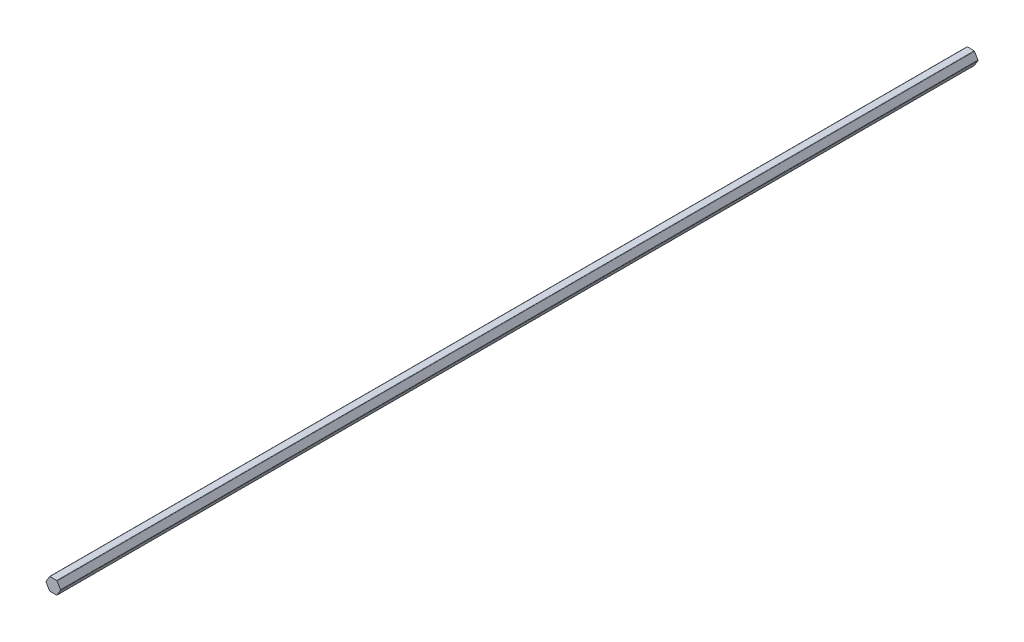
ISO-10303-21;
HEADER;
FILE_DESCRIPTION(('STEP AP214'),'2;1');
FILE_NAME('part.step','',(''),(''),'','','');
FILE_SCHEMA(('AUTOMOTIVE_DESIGN { 1 0 10303 214 1 1 1 1 }'));
ENDSEC;
DATA;
#1=APPLICATION_CONTEXT('core data for automotive mechanical design processes');
#2=APPLICATION_PROTOCOL_DEFINITION('international standard','automotive_design',2000,#1);
#3=PRODUCT_CONTEXT('',#1,'mechanical');
#4=PRODUCT('Part','Part','',(#3));
#5=PRODUCT_RELATED_PRODUCT_CATEGORY('part','',(#4));
#6=PRODUCT_DEFINITION_FORMATION('','',#4);
#7=PRODUCT_DEFINITION_CONTEXT('part definition',#1,'design');
#8=PRODUCT_DEFINITION('design','',#6,#7);
#9=PRODUCT_DEFINITION_SHAPE('','',#8);
#10=(LENGTH_UNIT() NAMED_UNIT(*) SI_UNIT(.MILLI.,.METRE.));
#11=(NAMED_UNIT(*) PLANE_ANGLE_UNIT() SI_UNIT($,.RADIAN.));
#12=(NAMED_UNIT(*) SI_UNIT($,.STERADIAN.) SOLID_ANGLE_UNIT());
#13=UNCERTAINTY_MEASURE_WITH_UNIT(LENGTH_MEASURE(1.E-05),#10,'distance_accuracy_value','');
#14=(GEOMETRIC_REPRESENTATION_CONTEXT(3) GLOBAL_UNCERTAINTY_ASSIGNED_CONTEXT((#13)) GLOBAL_UNIT_ASSIGNED_CONTEXT((#10,
#11,#12)) REPRESENTATION_CONTEXT('',''));
#15=CARTESIAN_POINT('',(0.,0.,0.));
#16=DIRECTION('',(0.,0.,1.));
#17=DIRECTION('',(1.,0.,0.));
#18=AXIS2_PLACEMENT_3D('',#15,#16,#17);
#19=CARTESIAN_POINT('',(-6.73109584837417,0.,457.2));
#20=DIRECTION('',(0.,0.,-1.));
#21=DIRECTION('',(-1.,0.,0.));
#22=AXIS2_PLACEMENT_3D('',#19,#20,#21);
#23=CYLINDRICAL_SURFACE('',#22,0.508);
#24=CARTESIAN_POINT('',(-6.73109584837417,0.,340.36));
#25=DIRECTION('',(0.,0.,-1.));
#26=DIRECTION('',(0.,1.,0.));
#27=AXIS2_PLACEMENT_3D('',#24,#25,#26);
#28=CIRCLE('',#27,0.508);
#29=CARTESIAN_POINT('',(-7.23909584837417,0.,340.36));
#30=VERTEX_POINT('',#29);
#31=CARTESIAN_POINT('',(-7.17103675349666,-0.254000000000007,340.36));
#32=VERTEX_POINT('',#31);
#33=EDGE_CURVE('P0_E257',#30,#32,#28,.F.);
#34=ORIENTED_EDGE('',*,*,#33,.F.);
#35=DIRECTION('',(0.,0.,-1.));
#36=VECTOR('',#35,1.);
#37=CARTESIAN_POINT('',(-7.23909584837417,0.,457.2));
#38=LINE('',#37,#36);
#39=CARTESIAN_POINT('',(-7.23909584837417,0.,301.9044));
#40=VERTEX_POINT('',#39);
#41=EDGE_CURVE('P0_E56',#30,#40,#38,.T.);
#42=ORIENTED_EDGE('',*,*,#41,.T.);
#43=CARTESIAN_POINT('',(-6.73109584837417,0.,301.9044));
#44=DIRECTION('',(0.,0.,1.));
#45=DIRECTION('',(1.,0.,0.));
#46=AXIS2_PLACEMENT_3D('',#43,#44,#45);
#47=CIRCLE('',#46,0.508);
#48=CARTESIAN_POINT('',(-7.17103675349667,-0.254000000000005,301.9044));
#49=VERTEX_POINT('',#48);
#50=EDGE_CURVE('P0_E226',#49,#40,#47,.F.);
#51=ORIENTED_EDGE('',*,*,#50,.F.);
#52=DIRECTION('',(0.,0.,-1.));
#53=VECTOR('',#52,1.);
#54=CARTESIAN_POINT('',(-7.17103675349666,-0.254000000000004,457.2));
#55=LINE('',#54,#53);
#56=EDGE_CURVE('P0_E181',#32,#49,#55,.T.);
#57=ORIENTED_EDGE('',*,*,#56,.F.);
#58=EDGE_LOOP('',(#34,#42,#51,#57));
#59=FACE_BOUND('',#58,.T.);
#60=ADVANCED_FACE('P0_F48',(#59),#23,.T.);
#61=CARTESIAN_POINT('',(3.65884186093541,-6.3373,457.2));
#62=DIRECTION('',(-0.866025403784439,0.5,0.));
#63=DIRECTION('',(0.,0.,1.));
#64=AXIS2_PLACEMENT_3D('',#61,#62,#63);
#65=PLANE('',#64);
#66=DIRECTION('',(0.,0.,1.));
#67=VECTOR('',#66,1.);
#68=CARTESIAN_POINT('',(7.17103675349667,-0.253999999999996,457.2));
#69=LINE('',#68,#67);
#70=CARTESIAN_POINT('',(7.17103675349666,-0.254000000000001,301.9044));
#71=VERTEX_POINT('',#70);
#72=CARTESIAN_POINT('',(7.17103675349667,-0.253999999999998,340.36));
#73=VERTEX_POINT('',#72);
#74=EDGE_CURVE('P0_E186',#71,#73,#69,.T.);
#75=ORIENTED_EDGE('',*,*,#74,.T.);
#76=DIRECTION('',(-0.5,-0.866025403784439,0.));
#77=VECTOR('',#76,1.);
#78=CARTESIAN_POINT('',(3.65884186093541,-6.3373,340.36));
#79=LINE('',#78,#77);
#80=CARTESIAN_POINT('',(3.80548882930958,-6.0833,340.36));
#81=VERTEX_POINT('',#80);
#82=EDGE_CURVE('P0_E200',#73,#81,#79,.T.);
#83=ORIENTED_EDGE('',*,*,#82,.T.);
#84=DIRECTION('',(0.,0.,-1.));
#85=VECTOR('',#84,1.);
#86=CARTESIAN_POINT('',(3.80548882930958,-6.0833,457.2));
#87=LINE('',#86,#85);
#88=CARTESIAN_POINT('',(3.80548882930958,-6.0833,301.9044));
#89=VERTEX_POINT('',#88);
#90=EDGE_CURVE('P0_E190',#81,#89,#87,.T.);
#91=ORIENTED_EDGE('',*,*,#90,.T.);
#92=DIRECTION('',(0.5,0.866025403784439,0.));
#93=VECTOR('',#92,1.);
#94=CARTESIAN_POINT('',(3.65884186093541,-6.3373,301.9044));
#95=LINE('',#94,#93);
#96=EDGE_CURVE('P0_E198',#89,#71,#95,.T.);
#97=ORIENTED_EDGE('',*,*,#96,.T.);
#98=EDGE_LOOP('',(#75,#83,#91,#97));
#99=FACE_BOUND('',#98,.T.);
#100=ADVANCED_FACE('P0_F197',(#99),#65,.F.);
#101=CARTESIAN_POINT('',(7.31768372187083,0.,457.2));
#102=DIRECTION('',(-0.866025403784439,-0.5,0.));
#103=DIRECTION('',(-0.5,0.866025403784439,0.));
#104=AXIS2_PLACEMENT_3D('',#101,#102,#103);
#105=PLANE('',#104);
#106=DIRECTION('',(0.,0.,1.));
#107=VECTOR('',#106,1.);
#108=CARTESIAN_POINT('',(3.80548882930958,6.0833,457.2));
#109=LINE('',#108,#107);
#110=CARTESIAN_POINT('',(3.80548882930958,6.0833,301.9044));
#111=VERTEX_POINT('',#110);
#112=CARTESIAN_POINT('',(3.80548882930958,6.0833,340.36));
#113=VERTEX_POINT('',#112);
#114=EDGE_CURVE('P0_E165',#111,#113,#109,.T.);
#115=ORIENTED_EDGE('',*,*,#114,.T.);
#116=DIRECTION('',(0.5,-0.866025403784439,0.));
#117=VECTOR('',#116,1.);
#118=CARTESIAN_POINT('',(7.31768372187083,0.,340.36));
#119=LINE('',#118,#117);
#120=CARTESIAN_POINT('',(7.17103675349667,0.254000000000004,340.36));
#121=VERTEX_POINT('',#120);
#122=EDGE_CURVE('P0_E62',#113,#121,#119,.T.);
#123=ORIENTED_EDGE('',*,*,#122,.T.);
#124=DIRECTION('',(0.,0.,-1.));
#125=VECTOR('',#124,1.);
#126=CARTESIAN_POINT('',(7.17103675349666,0.254,457.2));
#127=LINE('',#126,#125);
#128=CARTESIAN_POINT('',(7.17103675349666,0.254000000000006,301.9044));
#129=VERTEX_POINT('',#128);
#130=EDGE_CURVE('P0_E169',#121,#129,#127,.T.);
#131=ORIENTED_EDGE('',*,*,#130,.T.);
#132=DIRECTION('',(-0.5,0.866025403784439,0.));
#133=VECTOR('',#132,1.);
#134=CARTESIAN_POINT('',(7.31768372187083,0.,301.9044));
#135=LINE('',#134,#133);
#136=EDGE_CURVE('P0_E212',#129,#111,#135,.T.);
#137=ORIENTED_EDGE('',*,*,#136,.T.);
#138=EDGE_LOOP('',(#115,#123,#131,#137));
#139=FACE_BOUND('',#138,.T.);
#140=ADVANCED_FACE('P0_F246',(#139),#105,.F.);
#141=CARTESIAN_POINT('',(3.65884186093541,6.3373,457.2));
#142=DIRECTION('',(0.,-1.,0.));
#143=DIRECTION('',(0.,0.,-1.));
#144=AXIS2_PLACEMENT_3D('',#141,#142,#143);
#145=PLANE('',#144);
#146=DIRECTION('',(0.,0.,1.));
#147=VECTOR('',#146,1.);
#148=CARTESIAN_POINT('',(-3.36554792418709,6.3373,457.2));
#149=LINE('',#148,#147);
#150=CARTESIAN_POINT('',(-3.36554792418708,6.3373,301.9044));
#151=VERTEX_POINT('',#150);
#152=CARTESIAN_POINT('',(-3.36554792418708,6.3373,340.36));
#153=VERTEX_POINT('',#152);
#154=EDGE_CURVE('P0_E156',#151,#153,#149,.T.);
#155=ORIENTED_EDGE('',*,*,#154,.T.);
#156=DIRECTION('',(1.,0.,0.));
#157=VECTOR('',#156,1.);
#158=CARTESIAN_POINT('',(-23.9832777722907,6.3373,340.36));
#159=LINE('',#158,#157);
#160=CARTESIAN_POINT('',(3.36554792418708,6.3373,340.36));
#161=VERTEX_POINT('',#160);
#162=EDGE_CURVE('P0_E141',#153,#161,#159,.T.);
#163=ORIENTED_EDGE('',*,*,#162,.T.);
#164=DIRECTION('',(0.,0.,-1.));
#165=VECTOR('',#164,1.);
#166=CARTESIAN_POINT('',(3.36554792418709,6.3373,457.2));
#167=LINE('',#166,#165);
#168=CARTESIAN_POINT('',(3.36554792418708,6.3373,301.9044));
#169=VERTEX_POINT('',#168);
#170=EDGE_CURVE('P0_E166',#161,#169,#167,.T.);
#171=ORIENTED_EDGE('',*,*,#170,.T.);
#172=DIRECTION('',(-1.,0.,0.));
#173=VECTOR('',#172,1.);
#174=CARTESIAN_POINT('',(3.65884186093541,6.3373,301.9044));
#175=LINE('',#174,#173);
#176=EDGE_CURVE('P0_E164',#169,#151,#175,.T.);
#177=ORIENTED_EDGE('',*,*,#176,.T.);
#178=EDGE_LOOP('',(#155,#163,#171,#177));
#179=FACE_BOUND('',#178,.T.);
#180=ADVANCED_FACE('P0_F162',(#179),#145,.F.);
#181=CARTESIAN_POINT('',(-3.65884186093541,6.3373,457.2));
#182=DIRECTION('',(0.866025403784439,-0.5,0.));
#183=DIRECTION('',(0.,0.,-1.));
#184=AXIS2_PLACEMENT_3D('',#181,#182,#183);
#185=PLANE('',#184);
#186=DIRECTION('',(0.,0.,1.));
#187=VECTOR('',#186,1.);
#188=CARTESIAN_POINT('',(-7.17103675349666,0.253999999999995,457.2));
#189=LINE('',#188,#187);
#190=CARTESIAN_POINT('',(-7.17103675349667,0.253999999999994,301.9044));
#191=VERTEX_POINT('',#190);
#192=CARTESIAN_POINT('',(-7.17103675349667,0.253999999999996,340.36));
#193=VERTEX_POINT('',#192);
#194=EDGE_CURVE('P0_E171',#191,#193,#189,.T.);
#195=ORIENTED_EDGE('',*,*,#194,.T.);
#196=DIRECTION('',(0.5,0.866025403784439,0.));
#197=VECTOR('',#196,1.);
#198=CARTESIAN_POINT('',(-3.65884186093541,6.3373,340.36));
#199=LINE('',#198,#197);
#200=CARTESIAN_POINT('',(-3.80548882930958,6.0833,340.36));
#201=VERTEX_POINT('',#200);
#202=EDGE_CURVE('P0_E158',#193,#201,#199,.T.);
#203=ORIENTED_EDGE('',*,*,#202,.T.);
#204=DIRECTION('',(0.,0.,-1.));
#205=VECTOR('',#204,1.);
#206=CARTESIAN_POINT('',(-3.80548882930958,6.0833,457.2));
#207=LINE('',#206,#205);
#208=CARTESIAN_POINT('',(-3.80548882930958,6.0833,301.9044));
#209=VERTEX_POINT('',#208);
#210=EDGE_CURVE('P0_E157',#201,#209,#207,.T.);
#211=ORIENTED_EDGE('',*,*,#210,.T.);
#212=DIRECTION('',(0.5,0.866025403784439,0.));
#213=VECTOR('',#212,1.);
#214=CARTESIAN_POINT('',(-1.90274441465479,9.37895,301.9044));
#215=LINE('',#214,#213);
#216=EDGE_CURVE('P0_E234',#191,#209,#215,.T.);
#217=ORIENTED_EDGE('',*,*,#216,.F.);
#218=EDGE_LOOP('',(#195,#203,#211,#217));
#219=FACE_BOUND('',#218,.T.);
#220=ADVANCED_FACE('P0_F233',(#219),#185,.F.);
#221=CARTESIAN_POINT('',(-7.31768372187083,0.,457.2));
#222=DIRECTION('',(0.866025403784438,0.5,0.));
#223=DIRECTION('',(0.,0.,-1.));
#224=AXIS2_PLACEMENT_3D('',#221,#222,#223);
#225=PLANE('',#224);
#226=DIRECTION('',(0.,0.,1.));
#227=VECTOR('',#226,1.);
#228=CARTESIAN_POINT('',(-3.80548882930957,-6.0833,457.2));
#229=LINE('',#228,#227);
#230=CARTESIAN_POINT('',(-3.80548882930958,-6.0833,301.9044));
#231=VERTEX_POINT('',#230);
#232=CARTESIAN_POINT('',(-3.80548882930958,-6.0833,340.36));
#233=VERTEX_POINT('',#232);
#234=EDGE_CURVE('P0_E182',#231,#233,#229,.T.);
#235=ORIENTED_EDGE('',*,*,#234,.T.);
#236=DIRECTION('',(-0.5,0.866025403784438,0.));
#237=VECTOR('',#236,1.);
#238=CARTESIAN_POINT('',(-7.31768372187083,0.,340.36));
#239=LINE('',#238,#237);
#240=EDGE_CURVE('P0_E252',#233,#32,#239,.T.);
#241=ORIENTED_EDGE('',*,*,#240,.T.);
#242=ORIENTED_EDGE('',*,*,#56,.T.);
#243=DIRECTION('',(0.5,-0.866025403784438,0.));
#244=VECTOR('',#243,1.);
#245=CARTESIAN_POINT('',(-7.31768372187083,0.,301.9044));
#246=LINE('',#245,#244);
#247=EDGE_CURVE('P0_E223',#49,#231,#246,.T.);
#248=ORIENTED_EDGE('',*,*,#247,.T.);
#249=EDGE_LOOP('',(#235,#241,#242,#248));
#250=FACE_BOUND('',#249,.T.);
#251=ADVANCED_FACE('P0_F306',(#250),#225,.F.);
#252=CARTESIAN_POINT('',(-3.6588418609354,-6.3373,457.2));
#253=DIRECTION('',(0.,1.,0.));
#254=DIRECTION('',(1.,0.,0.));
#255=AXIS2_PLACEMENT_3D('',#252,#253,#254);
#256=PLANE('',#255);
#257=DIRECTION('',(0.,0.,1.));
#258=VECTOR('',#257,1.);
#259=CARTESIAN_POINT('',(3.36554792418709,-6.3373,457.2));
#260=LINE('',#259,#258);
#261=CARTESIAN_POINT('',(3.36554792418709,-6.3373,301.9044));
#262=VERTEX_POINT('',#261);
#263=CARTESIAN_POINT('',(3.36554792418708,-6.3373,340.36));
#264=VERTEX_POINT('',#263);
#265=EDGE_CURVE('P0_E175',#262,#264,#260,.T.);
#266=ORIENTED_EDGE('',*,*,#265,.T.);
#267=DIRECTION('',(1.,0.,0.));
#268=VECTOR('',#267,1.);
#269=CARTESIAN_POINT('',(-23.9832777722907,-6.3373,340.36));
#270=LINE('',#269,#268);
#271=CARTESIAN_POINT('',(-3.36554792418708,-6.3373,340.36));
#272=VERTEX_POINT('',#271);
#273=EDGE_CURVE('P0_E149',#272,#264,#270,.T.);
#274=ORIENTED_EDGE('',*,*,#273,.F.);
#275=DIRECTION('',(0.,0.,-1.));
#276=VECTOR('',#275,1.);
#277=CARTESIAN_POINT('',(-3.36554792418708,-6.3373,457.2));
#278=LINE('',#277,#276);
#279=CARTESIAN_POINT('',(-3.36554792418708,-6.3373,301.9044));
#280=VERTEX_POINT('',#279);
#281=EDGE_CURVE('P0_E178',#272,#280,#278,.T.);
#282=ORIENTED_EDGE('',*,*,#281,.T.);
#283=DIRECTION('',(1.,0.,0.));
#284=VECTOR('',#283,1.);
#285=CARTESIAN_POINT('',(-3.6588418609354,-6.3373,301.9044));
#286=LINE('',#285,#284);
#287=EDGE_CURVE('P0_E216',#280,#262,#286,.T.);
#288=ORIENTED_EDGE('',*,*,#287,.T.);
#289=EDGE_LOOP('',(#266,#274,#282,#288));
#290=FACE_BOUND('',#289,.T.);
#291=ADVANCED_FACE('P0_F309',(#290),#256,.F.);
#292=CARTESIAN_POINT('',(-3.36554792418708,-5.8293,457.2));
#293=DIRECTION('',(0.,0.,-1.));
#294=DIRECTION('',(-1.,0.,0.));
#295=AXIS2_PLACEMENT_3D('',#292,#293,#294);
#296=CYLINDRICAL_SURFACE('',#295,0.508);
#297=CARTESIAN_POINT('',(-3.36554792418708,-5.8293,340.36));
#298=DIRECTION('',(0.,0.,-1.));
#299=DIRECTION('',(0.,1.,0.));
#300=AXIS2_PLACEMENT_3D('',#297,#298,#299);
#301=CIRCLE('',#300,0.508);
#302=EDGE_CURVE('P0_E251',#233,#272,#301,.F.);
#303=ORIENTED_EDGE('',*,*,#302,.F.);
#304=ORIENTED_EDGE('',*,*,#234,.F.);
#305=CARTESIAN_POINT('',(-3.36554792418708,-5.8293,301.9044));
#306=DIRECTION('',(0.,0.,1.));
#307=DIRECTION('',(1.,0.,0.));
#308=AXIS2_PLACEMENT_3D('',#305,#306,#307);
#309=CIRCLE('',#308,0.508);
#310=EDGE_CURVE('P0_E218',#280,#231,#309,.F.);
#311=ORIENTED_EDGE('',*,*,#310,.F.);
#312=ORIENTED_EDGE('',*,*,#281,.F.);
#313=EDGE_LOOP('',(#303,#304,#311,#312));
#314=FACE_BOUND('',#313,.T.);
#315=ADVANCED_FACE('P0_F303',(#314),#296,.T.);
#316=CARTESIAN_POINT('',(-6.73109584837417,0.,457.2));
#317=DIRECTION('',(0.,0.,-1.));
#318=DIRECTION('',(-1.,0.,0.));
#319=AXIS2_PLACEMENT_3D('',#316,#317,#318);
#320=CYLINDRICAL_SURFACE('',#319,0.508);
#321=CARTESIAN_POINT('',(-6.73109584837417,0.,340.36));
#322=DIRECTION('',(0.,0.,-1.));
#323=DIRECTION('',(0.,1.,0.));
#324=AXIS2_PLACEMENT_3D('',#321,#322,#323);
#325=CIRCLE('',#324,0.508);
#326=EDGE_CURVE('P0_E259',#193,#30,#325,.F.);
#327=ORIENTED_EDGE('',*,*,#326,.F.);
#328=ORIENTED_EDGE('',*,*,#194,.F.);
#329=CARTESIAN_POINT('',(-6.73109584837417,0.,301.9044));
#330=DIRECTION('',(0.,0.,1.));
#331=DIRECTION('',(1.,0.,0.));
#332=AXIS2_PLACEMENT_3D('',#329,#330,#331);
#333=CIRCLE('',#332,0.508);
#334=EDGE_CURVE('P0_E179',#40,#191,#333,.F.);
#335=ORIENTED_EDGE('',*,*,#334,.F.);
#336=ORIENTED_EDGE('',*,*,#41,.F.);
#337=EDGE_LOOP('',(#327,#328,#335,#336));
#338=FACE_BOUND('',#337,.T.);
#339=ADVANCED_FACE('P0_F301',(#338),#320,.T.);
#340=CARTESIAN_POINT('',(3.36554792418709,-5.8293,457.2));
#341=DIRECTION('',(0.,0.,-1.));
#342=DIRECTION('',(-1.,0.,0.));
#343=AXIS2_PLACEMENT_3D('',#340,#341,#342);
#344=CYLINDRICAL_SURFACE('',#343,0.508);
#345=CARTESIAN_POINT('',(3.36554792418709,-5.8293,340.36));
#346=DIRECTION('',(0.,0.,-1.));
#347=DIRECTION('',(0.,1.,0.));
#348=AXIS2_PLACEMENT_3D('',#345,#346,#347);
#349=CIRCLE('',#348,0.508);
#350=EDGE_CURVE('P0_E159',#264,#81,#349,.F.);
#351=ORIENTED_EDGE('',*,*,#350,.F.);
#352=ORIENTED_EDGE('',*,*,#265,.F.);
#353=CARTESIAN_POINT('',(3.36554792418709,-5.8293,301.9044));
#354=DIRECTION('',(0.,0.,1.));
#355=DIRECTION('',(1.,0.,0.));
#356=AXIS2_PLACEMENT_3D('',#353,#354,#355);
#357=CIRCLE('',#356,0.508);
#358=EDGE_CURVE('P0_E207',#89,#262,#357,.F.);
#359=ORIENTED_EDGE('',*,*,#358,.F.);
#360=ORIENTED_EDGE('',*,*,#90,.F.);
#361=EDGE_LOOP('',(#351,#352,#359,#360));
#362=FACE_BOUND('',#361,.T.);
#363=ADVANCED_FACE('P0_F215',(#362),#344,.T.);
#364=CARTESIAN_POINT('',(6.73109584837417,0.,457.2));
#365=DIRECTION('',(0.,0.,-1.));
#366=DIRECTION('',(-1.,0.,0.));
#367=AXIS2_PLACEMENT_3D('',#364,#365,#366);
#368=CYLINDRICAL_SURFACE('',#367,0.508);
#369=CARTESIAN_POINT('',(6.73109584837417,0.,340.36));
#370=DIRECTION('',(0.,0.,-1.));
#371=DIRECTION('',(0.,1.,0.));
#372=AXIS2_PLACEMENT_3D('',#369,#370,#371);
#373=CIRCLE('',#372,0.508);
#374=EDGE_CURVE('P0_E264',#73,#121,#373,.F.);
#375=ORIENTED_EDGE('',*,*,#374,.F.);
#376=ORIENTED_EDGE('',*,*,#74,.F.);
#377=CARTESIAN_POINT('',(6.73109584837417,0.,301.9044));
#378=DIRECTION('',(0.,0.,1.));
#379=DIRECTION('',(1.,0.,0.));
#380=AXIS2_PLACEMENT_3D('',#377,#378,#379);
#381=CIRCLE('',#380,0.508);
#382=EDGE_CURVE('P0_E211',#129,#71,#381,.F.);
#383=ORIENTED_EDGE('',*,*,#382,.F.);
#384=ORIENTED_EDGE('',*,*,#130,.F.);
#385=EDGE_LOOP('',(#375,#376,#383,#384));
#386=FACE_BOUND('',#385,.T.);
#387=ADVANCED_FACE('P0_F50',(#386),#368,.T.);
#388=CARTESIAN_POINT('',(-3.36554792418709,5.8293,457.2));
#389=DIRECTION('',(0.,0.,-1.));
#390=DIRECTION('',(-1.,0.,0.));
#391=AXIS2_PLACEMENT_3D('',#388,#389,#390);
#392=CYLINDRICAL_SURFACE('',#391,0.508);
#393=CARTESIAN_POINT('',(-3.36554792418709,5.8293,340.36));
#394=DIRECTION('',(0.,0.,-1.));
#395=DIRECTION('',(0.,1.,0.));
#396=AXIS2_PLACEMENT_3D('',#393,#394,#395);
#397=CIRCLE('',#396,0.508);
#398=EDGE_CURVE('P0_E144',#153,#201,#397,.F.);
#399=ORIENTED_EDGE('',*,*,#398,.F.);
#400=ORIENTED_EDGE('',*,*,#154,.F.);
#401=CARTESIAN_POINT('',(-3.36554792418709,5.8293,301.9044));
#402=DIRECTION('',(0.,0.,1.));
#403=DIRECTION('',(1.,0.,0.));
#404=AXIS2_PLACEMENT_3D('',#401,#402,#403);
#405=CIRCLE('',#404,0.508);
#406=EDGE_CURVE('P0_E235',#209,#151,#405,.F.);
#407=ORIENTED_EDGE('',*,*,#406,.F.);
#408=ORIENTED_EDGE('',*,*,#210,.F.);
#409=EDGE_LOOP('',(#399,#400,#407,#408));
#410=FACE_BOUND('',#409,.T.);
#411=ADVANCED_FACE('P0_F154',(#410),#392,.T.);
#412=CARTESIAN_POINT('',(3.36554792418709,5.8293,457.2));
#413=DIRECTION('',(0.,0.,-1.));
#414=DIRECTION('',(-1.,0.,0.));
#415=AXIS2_PLACEMENT_3D('',#412,#413,#414);
#416=CYLINDRICAL_SURFACE('',#415,0.508);
#417=CARTESIAN_POINT('',(3.36554792418709,5.8293,340.36));
#418=DIRECTION('',(0.,0.,-1.));
#419=DIRECTION('',(0.,1.,0.));
#420=AXIS2_PLACEMENT_3D('',#417,#418,#419);
#421=CIRCLE('',#420,0.508);
#422=EDGE_CURVE('P0_E12',#113,#161,#421,.F.);
#423=ORIENTED_EDGE('',*,*,#422,.F.);
#424=ORIENTED_EDGE('',*,*,#114,.F.);
#425=CARTESIAN_POINT('',(3.36554792418709,5.8293,301.9044));
#426=DIRECTION('',(0.,0.,1.));
#427=DIRECTION('',(1.,0.,0.));
#428=AXIS2_PLACEMENT_3D('',#425,#426,#427);
#429=CIRCLE('',#428,0.508);
#430=EDGE_CURVE('P0_E237',#169,#111,#429,.F.);
#431=ORIENTED_EDGE('',*,*,#430,.F.);
#432=ORIENTED_EDGE('',*,*,#170,.F.);
#433=EDGE_LOOP('',(#423,#424,#431,#432));
#434=FACE_BOUND('',#433,.T.);
#435=ADVANCED_FACE('P0_F250',(#434),#416,.T.);
#436=CARTESIAN_POINT('',(42.0913460975947,-16.02105,301.9044));
#437=DIRECTION('',(0.,0.,1.));
#438=DIRECTION('',(1.,0.,0.));
#439=AXIS2_PLACEMENT_3D('',#436,#437,#438);
#440=PLANE('',#439);
#441=CARTESIAN_POINT('',(0.,0.,301.9044));
#442=DIRECTION('',(0.,0.,-1.));
#443=DIRECTION('',(-1.,0.,0.));
#444=AXIS2_PLACEMENT_3D('',#441,#442,#443);
#445=CIRCLE('',#444,2.413);
#446=CARTESIAN_POINT('',(-2.413,0.,301.9044));
#447=VERTEX_POINT('',#446);
#448=EDGE_CURVE('P0_E269',#447,#447,#445,.T.);
#449=ORIENTED_EDGE('',*,*,#448,.F.);
#450=EDGE_LOOP('',(#449));
#451=FACE_BOUND('',#450,.T.);
#452=ORIENTED_EDGE('',*,*,#334,.T.);
#453=ORIENTED_EDGE('',*,*,#216,.T.);
#454=ORIENTED_EDGE('',*,*,#406,.T.);
#455=ORIENTED_EDGE('',*,*,#176,.F.);
#456=ORIENTED_EDGE('',*,*,#430,.T.);
#457=ORIENTED_EDGE('',*,*,#136,.F.);
#458=ORIENTED_EDGE('',*,*,#382,.T.);
#459=ORIENTED_EDGE('',*,*,#96,.F.);
#460=ORIENTED_EDGE('',*,*,#358,.T.);
#461=ORIENTED_EDGE('',*,*,#287,.F.);
#462=ORIENTED_EDGE('',*,*,#310,.T.);
#463=ORIENTED_EDGE('',*,*,#247,.F.);
#464=ORIENTED_EDGE('',*,*,#50,.T.);
#465=EDGE_LOOP('',(#452,#453,#454,#455,#456,#457,#458,#459,#460,#461,#462,#463,#464));
#466=FACE_BOUND('',#465,.T.);
#467=ADVANCED_FACE('P0_F205',(#451,#466),#440,.F.);
#468=CARTESIAN_POINT('',(-23.9832777722907,6.3373,340.36));
#469=DIRECTION('',(0.,0.,-1.));
#470=DIRECTION('',(0.,1.,0.));
#471=AXIS2_PLACEMENT_3D('',#468,#469,#470);
#472=PLANE('',#471);
#473=ORIENTED_EDGE('',*,*,#302,.T.);
#474=ORIENTED_EDGE('',*,*,#273,.T.);
#475=ORIENTED_EDGE('',*,*,#350,.T.);
#476=ORIENTED_EDGE('',*,*,#82,.F.);
#477=ORIENTED_EDGE('',*,*,#374,.T.);
#478=ORIENTED_EDGE('',*,*,#122,.F.);
#479=ORIENTED_EDGE('',*,*,#422,.T.);
#480=ORIENTED_EDGE('',*,*,#162,.F.);
#481=ORIENTED_EDGE('',*,*,#398,.T.);
#482=ORIENTED_EDGE('',*,*,#202,.F.);
#483=ORIENTED_EDGE('',*,*,#326,.T.);
#484=ORIENTED_EDGE('',*,*,#33,.T.);
#485=ORIENTED_EDGE('',*,*,#240,.F.);
#486=EDGE_LOOP('',(#473,#474,#475,#476,#477,#478,#479,#480,#481,#482,#483,#484,#485));
#487=FACE_BOUND('',#486,.T.);
#488=ADVANCED_FACE('P0_F143',(#487),#472,.F.);
#489=CARTESIAN_POINT('',(0.,0.,313.5884));
#490=DIRECTION('',(0.,0.,-1.));
#491=DIRECTION('',(-1.,0.,0.));
#492=AXIS2_PLACEMENT_3D('',#489,#490,#491);
#493=CYLINDRICAL_SURFACE('',#492,2.413);
#494=CARTESIAN_POINT('',(0.,0.,313.5884));
#495=DIRECTION('',(0.,0.,-1.));
#496=DIRECTION('',(-1.,0.,0.));
#497=AXIS2_PLACEMENT_3D('',#494,#495,#496);
#498=CIRCLE('',#497,2.413);
#499=CARTESIAN_POINT('',(-2.413,0.,313.5884));
#500=VERTEX_POINT('',#499);
#501=EDGE_CURVE('P0_E267',#500,#500,#498,.T.);
#502=ORIENTED_EDGE('',*,*,#501,.F.);
#503=EDGE_LOOP('',(#502));
#504=FACE_BOUND('',#503,.T.);
#505=ORIENTED_EDGE('',*,*,#448,.T.);
#506=EDGE_LOOP('',(#505));
#507=FACE_BOUND('',#506,.T.);
#508=ADVANCED_FACE('P0_F277',(#504,#507),#493,.F.);
#509=CARTESIAN_POINT('',(0.,0.,313.5884));
#510=DIRECTION('',(0.,0.,-1.));
#511=DIRECTION('',(-1.,0.,0.));
#512=AXIS2_PLACEMENT_3D('',#509,#510,#511);
#513=PLANE('',#512);
#514=ORIENTED_EDGE('',*,*,#501,.T.);
#515=EDGE_LOOP('',(#514));
#516=FACE_BOUND('',#515,.T.);
#517=ADVANCED_FACE('P0_F275',(#516),#513,.T.);
#518=CLOSED_SHELL('',(#60,#100,#140,#180,#220,#251,#291,#315,#339,#363,#387,#411,#435,#467,#488,
#508,#517));
#519=MANIFOLD_SOLID_BREP('P0_B2',#518);
#520=CARTESIAN_POINT('',(-6.73109584837417,0.,457.2));
#521=DIRECTION('',(0.,0.,-1.));
#522=DIRECTION('',(-1.,0.,0.));
#523=AXIS2_PLACEMENT_3D('',#520,#521,#522);
#524=CYLINDRICAL_SURFACE('',#523,0.508);
#525=CARTESIAN_POINT('',(-6.73109584837417,0.,457.2));
#526=DIRECTION('',(0.,0.,1.));
#527=DIRECTION('',(1.,0.,0.));
#528=AXIS2_PLACEMENT_3D('',#525,#526,#527);
#529=CIRCLE('',#528,0.508);
#530=CARTESIAN_POINT('',(-7.23909584837417,0.,457.2));
#531=VERTEX_POINT('',#530);
#532=CARTESIAN_POINT('',(-7.17103675349666,-0.254000000000004,457.2));
#533=VERTEX_POINT('',#532);
#534=EDGE_CURVE('P1_E41',#531,#533,#529,.T.);
#535=ORIENTED_EDGE('',*,*,#534,.F.);
#536=DIRECTION('',(0.,0.,-1.));
#537=VECTOR('',#536,1.);
#538=CARTESIAN_POINT('',(-7.23909584837417,0.,457.2));
#539=LINE('',#538,#537);
#540=CARTESIAN_POINT('',(-7.23909584837417,0.,-457.2));
#541=VERTEX_POINT('',#540);
#542=EDGE_CURVE('P1_E12',#531,#541,#539,.T.);
#543=ORIENTED_EDGE('',*,*,#542,.T.);
#544=CARTESIAN_POINT('',(-6.73109584837417,0.,-457.2));
#545=DIRECTION('',(0.,0.,-1.));
#546=DIRECTION('',(1.,0.,0.));
#547=AXIS2_PLACEMENT_3D('',#544,#545,#546);
#548=CIRCLE('',#547,0.508);
#549=CARTESIAN_POINT('',(-7.17103675349666,-0.254000000000004,-457.2));
#550=VERTEX_POINT('',#549);
#551=EDGE_CURVE('P1_E55',#550,#541,#548,.T.);
#552=ORIENTED_EDGE('',*,*,#551,.F.);
#553=DIRECTION('',(0.,0.,-1.));
#554=VECTOR('',#553,1.);
#555=CARTESIAN_POINT('',(-7.17103675349666,-0.254000000000004,457.2));
#556=LINE('',#555,#554);
#557=EDGE_CURVE('P1_E224',#533,#550,#556,.T.);
#558=ORIENTED_EDGE('',*,*,#557,.F.);
#559=EDGE_LOOP('',(#535,#543,#552,#558));
#560=FACE_BOUND('',#559,.T.);
#561=ADVANCED_FACE('P1_F18',(#560),#524,.T.);
#562=CARTESIAN_POINT('',(3.65884186093541,-6.3373,457.2));
#563=DIRECTION('',(-0.866025403784439,0.5,0.));
#564=DIRECTION('',(0.,0.,1.));
#565=AXIS2_PLACEMENT_3D('',#562,#563,#564);
#566=PLANE('',#565);
#567=DIRECTION('',(0.5,0.866025403784439,0.));
#568=VECTOR('',#567,1.);
#569=CARTESIAN_POINT('',(3.65884186093541,-6.3373,457.2));
#570=LINE('',#569,#568);
#571=CARTESIAN_POINT('',(3.80548882930958,-6.0833,457.2));
#572=VERTEX_POINT('',#571);
#573=CARTESIAN_POINT('',(7.17103675349666,-0.254,457.2));
#574=VERTEX_POINT('',#573);
#575=EDGE_CURVE('P1_E161',#572,#574,#570,.T.);
#576=ORIENTED_EDGE('',*,*,#575,.F.);
#577=DIRECTION('',(0.,0.,-1.));
#578=VECTOR('',#577,1.);
#579=CARTESIAN_POINT('',(3.80548882930958,-6.0833,457.2));
#580=LINE('',#579,#578);
#581=CARTESIAN_POINT('',(3.80548882930958,-6.0833,-457.2));
#582=VERTEX_POINT('',#581);
#583=EDGE_CURVE('P1_E28',#572,#582,#580,.T.);
#584=ORIENTED_EDGE('',*,*,#583,.T.);
#585=DIRECTION('',(0.5,0.866025403784439,0.));
#586=VECTOR('',#585,1.);
#587=CARTESIAN_POINT('',(3.65884186093541,-6.3373,-457.2));
#588=LINE('',#587,#586);
#589=CARTESIAN_POINT('',(7.17103675349666,-0.254,-457.2));
#590=VERTEX_POINT('',#589);
#591=EDGE_CURVE('P1_E176',#582,#590,#588,.T.);
#592=ORIENTED_EDGE('',*,*,#591,.T.);
#593=DIRECTION('',(0.,0.,1.));
#594=VECTOR('',#593,1.);
#595=CARTESIAN_POINT('',(7.17103675349667,-0.253999999999996,457.2));
#596=LINE('',#595,#594);
#597=EDGE_CURVE('P1_E169',#590,#574,#596,.T.);
#598=ORIENTED_EDGE('',*,*,#597,.T.);
#599=EDGE_LOOP('',(#576,#584,#592,#598));
#600=FACE_BOUND('',#599,.T.);
#601=ADVANCED_FACE('P1_F186',(#600),#566,.F.);
#602=CARTESIAN_POINT('',(7.31768372187083,0.,457.2));
#603=DIRECTION('',(-0.866025403784439,-0.5,0.));
#604=DIRECTION('',(-0.5,0.866025403784439,0.));
#605=AXIS2_PLACEMENT_3D('',#602,#603,#604);
#606=PLANE('',#605);
#607=DIRECTION('',(-0.5,0.866025403784439,0.));
#608=VECTOR('',#607,1.);
#609=CARTESIAN_POINT('',(7.31768372187083,0.,457.2));
#610=LINE('',#609,#608);
#611=CARTESIAN_POINT('',(7.17103675349666,0.254000000000004,457.2));
#612=VERTEX_POINT('',#611);
#613=CARTESIAN_POINT('',(3.80548882930957,6.0833,457.2));
#614=VERTEX_POINT('',#613);
#615=EDGE_CURVE('P1_E248',#612,#614,#610,.T.);
#616=ORIENTED_EDGE('',*,*,#615,.F.);
#617=DIRECTION('',(0.,0.,-1.));
#618=VECTOR('',#617,1.);
#619=CARTESIAN_POINT('',(7.17103675349666,0.254,457.2));
#620=LINE('',#619,#618);
#621=CARTESIAN_POINT('',(7.17103675349666,0.254000000000004,-457.2));
#622=VERTEX_POINT('',#621);
#623=EDGE_CURVE('P1_E212',#612,#622,#620,.T.);
#624=ORIENTED_EDGE('',*,*,#623,.T.);
#625=DIRECTION('',(-0.5,0.866025403784439,0.));
#626=VECTOR('',#625,1.);
#627=CARTESIAN_POINT('',(7.31768372187083,0.,-457.2));
#628=LINE('',#627,#626);
#629=CARTESIAN_POINT('',(3.80548882930957,6.0833,-457.2));
#630=VERTEX_POINT('',#629);
#631=EDGE_CURVE('P1_E204',#622,#630,#628,.T.);
#632=ORIENTED_EDGE('',*,*,#631,.T.);
#633=DIRECTION('',(0.,0.,1.));
#634=VECTOR('',#633,1.);
#635=CARTESIAN_POINT('',(3.80548882930958,6.0833,457.2));
#636=LINE('',#635,#634);
#637=EDGE_CURVE('P1_E207',#630,#614,#636,.T.);
#638=ORIENTED_EDGE('',*,*,#637,.T.);
#639=EDGE_LOOP('',(#616,#624,#632,#638));
#640=FACE_BOUND('',#639,.T.);
#641=ADVANCED_FACE('P1_F539',(#640),#606,.F.);
#642=CARTESIAN_POINT('',(3.65884186093541,6.3373,457.2));
#643=DIRECTION('',(0.,-1.,0.));
#644=DIRECTION('',(0.,0.,-1.));
#645=AXIS2_PLACEMENT_3D('',#642,#643,#644);
#646=PLANE('',#645);
#647=DIRECTION('',(-1.,0.,0.));
#648=VECTOR('',#647,1.);
#649=CARTESIAN_POINT('',(3.65884186093541,6.3373,-457.2));
#650=LINE('',#649,#648);
#651=CARTESIAN_POINT('',(3.36554792418709,6.3373,-457.2));
#652=VERTEX_POINT('',#651);
#653=CARTESIAN_POINT('',(-3.36554792418708,6.3373,-457.2));
#654=VERTEX_POINT('',#653);
#655=EDGE_CURVE('P1_E211',#652,#654,#650,.T.);
#656=ORIENTED_EDGE('',*,*,#655,.T.);
#657=DIRECTION('',(0.,0.,1.));
#658=VECTOR('',#657,1.);
#659=CARTESIAN_POINT('',(-3.36554792418709,6.3373,457.2));
#660=LINE('',#659,#658);
#661=CARTESIAN_POINT('',(-3.36554792418708,6.3373,457.2));
#662=VERTEX_POINT('',#661);
#663=EDGE_CURVE('P1_E252',#654,#662,#660,.T.);
#664=ORIENTED_EDGE('',*,*,#663,.T.);
#665=DIRECTION('',(-1.,0.,0.));
#666=VECTOR('',#665,1.);
#667=CARTESIAN_POINT('',(3.65884186093541,6.3373,457.2));
#668=LINE('',#667,#666);
#669=CARTESIAN_POINT('',(3.36554792418709,6.3373,457.2));
#670=VERTEX_POINT('',#669);
#671=EDGE_CURVE('P1_E216',#670,#662,#668,.T.);
#672=ORIENTED_EDGE('',*,*,#671,.F.);
#673=DIRECTION('',(0.,0.,-1.));
#674=VECTOR('',#673,1.);
#675=CARTESIAN_POINT('',(3.36554792418709,6.3373,457.2));
#676=LINE('',#675,#674);
#677=EDGE_CURVE('P1_E249',#670,#652,#676,.T.);
#678=ORIENTED_EDGE('',*,*,#677,.T.);
#679=EDGE_LOOP('',(#656,#664,#672,#678));
#680=FACE_BOUND('',#679,.T.);
#681=ADVANCED_FACE('P1_F534',(#680),#646,.F.);
#682=CARTESIAN_POINT('',(-3.65884186093541,6.3373,457.2));
#683=DIRECTION('',(0.866025403784439,-0.5,0.));
#684=DIRECTION('',(0.,0.,-1.));
#685=AXIS2_PLACEMENT_3D('',#682,#683,#684);
#686=PLANE('',#685);
#687=DIRECTION('',(-0.5,-0.866025403784439,0.));
#688=VECTOR('',#687,1.);
#689=CARTESIAN_POINT('',(-3.65884186093541,6.3373,-457.2));
#690=LINE('',#689,#688);
#691=CARTESIAN_POINT('',(-3.80548882930958,6.0833,-457.2));
#692=VERTEX_POINT('',#691);
#693=CARTESIAN_POINT('',(-7.17103675349666,0.253999999999997,-457.2));
#694=VERTEX_POINT('',#693);
#695=EDGE_CURVE('P1_E253',#692,#694,#690,.T.);
#696=ORIENTED_EDGE('',*,*,#695,.T.);
#697=DIRECTION('',(0.,0.,1.));
#698=VECTOR('',#697,1.);
#699=CARTESIAN_POINT('',(-7.17103675349666,0.253999999999995,457.2));
#700=LINE('',#699,#698);
#701=CARTESIAN_POINT('',(-7.17103675349666,0.253999999999997,457.2));
#702=VERTEX_POINT('',#701);
#703=EDGE_CURVE('P1_E293',#694,#702,#700,.T.);
#704=ORIENTED_EDGE('',*,*,#703,.T.);
#705=DIRECTION('',(-0.5,-0.866025403784439,0.));
#706=VECTOR('',#705,1.);
#707=CARTESIAN_POINT('',(-3.65884186093541,6.3373,457.2));
#708=LINE('',#707,#706);
#709=CARTESIAN_POINT('',(-3.80548882930958,6.0833,457.2));
#710=VERTEX_POINT('',#709);
#711=EDGE_CURVE('P1_E257',#710,#702,#708,.T.);
#712=ORIENTED_EDGE('',*,*,#711,.F.);
#713=DIRECTION('',(0.,0.,-1.));
#714=VECTOR('',#713,1.);
#715=CARTESIAN_POINT('',(-3.80548882930958,6.0833,457.2));
#716=LINE('',#715,#714);
#717=EDGE_CURVE('P1_E223',#710,#692,#716,.T.);
#718=ORIENTED_EDGE('',*,*,#717,.T.);
#719=EDGE_LOOP('',(#696,#704,#712,#718));
#720=FACE_BOUND('',#719,.T.);
#721=ADVANCED_FACE('P1_F538',(#720),#686,.F.);
#722=CARTESIAN_POINT('',(-7.31768372187083,0.,457.2));
#723=DIRECTION('',(0.866025403784438,0.5,0.));
#724=DIRECTION('',(0.,0.,-1.));
#725=AXIS2_PLACEMENT_3D('',#722,#723,#724);
#726=PLANE('',#725);
#727=DIRECTION('',(0.5,-0.866025403784439,0.));
#728=VECTOR('',#727,1.);
#729=CARTESIAN_POINT('',(-7.31768372187083,0.,-457.2));
#730=LINE('',#729,#728);
#731=CARTESIAN_POINT('',(-3.80548882930957,-6.0833,-457.2));
#732=VERTEX_POINT('',#731);
#733=EDGE_CURVE('P1_E220',#550,#732,#730,.T.);
#734=ORIENTED_EDGE('',*,*,#733,.T.);
#735=DIRECTION('',(0.,0.,1.));
#736=VECTOR('',#735,1.);
#737=CARTESIAN_POINT('',(-3.80548882930957,-6.0833,457.2));
#738=LINE('',#737,#736);
#739=CARTESIAN_POINT('',(-3.80548882930957,-6.0833,457.2));
#740=VERTEX_POINT('',#739);
#741=EDGE_CURVE('P1_E150',#732,#740,#738,.T.);
#742=ORIENTED_EDGE('',*,*,#741,.T.);
#743=DIRECTION('',(0.5,-0.866025403784439,0.));
#744=VECTOR('',#743,1.);
#745=CARTESIAN_POINT('',(-7.31768372187083,0.,457.2));
#746=LINE('',#745,#744);
#747=EDGE_CURVE('P1_E138',#533,#740,#746,.T.);
#748=ORIENTED_EDGE('',*,*,#747,.F.);
#749=ORIENTED_EDGE('',*,*,#557,.T.);
#750=EDGE_LOOP('',(#734,#742,#748,#749));
#751=FACE_BOUND('',#750,.T.);
#752=ADVANCED_FACE('P1_F529',(#751),#726,.F.);
#753=CARTESIAN_POINT('',(-3.6588418609354,-6.3373,457.2));
#754=DIRECTION('',(0.,1.,0.));
#755=DIRECTION('',(1.,0.,0.));
#756=AXIS2_PLACEMENT_3D('',#753,#754,#755);
#757=PLANE('',#756);
#758=DIRECTION('',(1.,0.,0.));
#759=VECTOR('',#758,1.);
#760=CARTESIAN_POINT('',(-3.6588418609354,-6.3373,457.2));
#761=LINE('',#760,#759);
#762=CARTESIAN_POINT('',(-3.36554792418708,-6.3373,457.2));
#763=VERTEX_POINT('',#762);
#764=CARTESIAN_POINT('',(3.36554792418709,-6.3373,457.2));
#765=VERTEX_POINT('',#764);
#766=EDGE_CURVE('P1_E244',#763,#765,#761,.T.);
#767=ORIENTED_EDGE('',*,*,#766,.F.);
#768=DIRECTION('',(0.,0.,-1.));
#769=VECTOR('',#768,1.);
#770=CARTESIAN_POINT('',(-3.36554792418708,-6.3373,457.2));
#771=LINE('',#770,#769);
#772=CARTESIAN_POINT('',(-3.36554792418708,-6.3373,-457.2));
#773=VERTEX_POINT('',#772);
#774=EDGE_CURVE('P1_E228',#763,#773,#771,.T.);
#775=ORIENTED_EDGE('',*,*,#774,.T.);
#776=DIRECTION('',(1.,0.,0.));
#777=VECTOR('',#776,1.);
#778=CARTESIAN_POINT('',(-3.6588418609354,-6.3373,-457.2));
#779=LINE('',#778,#777);
#780=CARTESIAN_POINT('',(3.36554792418709,-6.3373,-457.2));
#781=VERTEX_POINT('',#780);
#782=EDGE_CURVE('P1_E279',#773,#781,#779,.T.);
#783=ORIENTED_EDGE('',*,*,#782,.T.);
#784=DIRECTION('',(0.,0.,1.));
#785=VECTOR('',#784,1.);
#786=CARTESIAN_POINT('',(3.36554792418709,-6.3373,457.2));
#787=LINE('',#786,#785);
#788=EDGE_CURVE('P1_E193',#781,#765,#787,.T.);
#789=ORIENTED_EDGE('',*,*,#788,.T.);
#790=EDGE_LOOP('',(#767,#775,#783,#789));
#791=FACE_BOUND('',#790,.T.);
#792=ADVANCED_FACE('P1_F302',(#791),#757,.F.);
#793=CARTESIAN_POINT('',(7.31768372187083,0.,457.2));
#794=DIRECTION('',(0.,0.,1.));
#795=DIRECTION('',(1.,0.,0.));
#796=AXIS2_PLACEMENT_3D('',#793,#794,#795);
#797=PLANE('',#796);
#798=ORIENTED_EDGE('',*,*,#747,.T.);
#799=CARTESIAN_POINT('',(-3.36554792418708,-5.8293,457.2));
#800=DIRECTION('',(0.,0.,1.));
#801=DIRECTION('',(1.,0.,0.));
#802=AXIS2_PLACEMENT_3D('',#799,#800,#801);
#803=CIRCLE('',#802,0.508);
#804=EDGE_CURVE('P1_E297',#740,#763,#803,.T.);
#805=ORIENTED_EDGE('',*,*,#804,.T.);
#806=ORIENTED_EDGE('',*,*,#766,.T.);
#807=CARTESIAN_POINT('',(3.36554792418709,-5.8293,457.2));
#808=DIRECTION('',(0.,0.,1.));
#809=DIRECTION('',(1.,0.,0.));
#810=AXIS2_PLACEMENT_3D('',#807,#808,#809);
#811=CIRCLE('',#810,0.508);
#812=EDGE_CURVE('P1_E241',#765,#572,#811,.T.);
#813=ORIENTED_EDGE('',*,*,#812,.T.);
#814=ORIENTED_EDGE('',*,*,#575,.T.);
#815=CARTESIAN_POINT('',(6.73109584837417,0.,457.2));
#816=DIRECTION('',(0.,0.,1.));
#817=DIRECTION('',(1.,0.,0.));
#818=AXIS2_PLACEMENT_3D('',#815,#816,#817);
#819=CIRCLE('',#818,0.508);
#820=EDGE_CURVE('P1_E284',#574,#612,#819,.T.);
#821=ORIENTED_EDGE('',*,*,#820,.T.);
#822=ORIENTED_EDGE('',*,*,#615,.T.);
#823=CARTESIAN_POINT('',(3.36554792418709,5.8293,457.2));
#824=DIRECTION('',(0.,0.,1.));
#825=DIRECTION('',(1.,0.,0.));
#826=AXIS2_PLACEMENT_3D('',#823,#824,#825);
#827=CIRCLE('',#826,0.508);
#828=EDGE_CURVE('P1_E219',#614,#670,#827,.T.);
#829=ORIENTED_EDGE('',*,*,#828,.T.);
#830=ORIENTED_EDGE('',*,*,#671,.T.);
#831=CARTESIAN_POINT('',(-3.36554792418709,5.8293,457.2));
#832=DIRECTION('',(0.,0.,1.));
#833=DIRECTION('',(1.,0.,0.));
#834=AXIS2_PLACEMENT_3D('',#831,#832,#833);
#835=CIRCLE('',#834,0.508);
#836=EDGE_CURVE('P1_E22',#662,#710,#835,.T.);
#837=ORIENTED_EDGE('',*,*,#836,.T.);
#838=ORIENTED_EDGE('',*,*,#711,.T.);
#839=CARTESIAN_POINT('',(-6.73109584837417,0.,457.2));
#840=DIRECTION('',(0.,0.,1.));
#841=DIRECTION('',(1.,0.,0.));
#842=AXIS2_PLACEMENT_3D('',#839,#840,#841);
#843=CIRCLE('',#842,0.508);
#844=EDGE_CURVE('P1_E237',#702,#531,#843,.T.);
#845=ORIENTED_EDGE('',*,*,#844,.T.);
#846=ORIENTED_EDGE('',*,*,#534,.T.);
#847=EDGE_LOOP('',(#798,#805,#806,#813,#814,#821,#822,#829,#830,#837,#838,#845,#846));
#848=FACE_BOUND('',#847,.T.);
#849=ADVANCED_FACE('P1_F305',(#848),#797,.T.);
#850=CARTESIAN_POINT('',(7.31768372187083,0.,-457.2));
#851=DIRECTION('',(0.,0.,1.));
#852=DIRECTION('',(1.,0.,0.));
#853=AXIS2_PLACEMENT_3D('',#850,#851,#852);
#854=PLANE('',#853);
#855=ORIENTED_EDGE('',*,*,#782,.F.);
#856=CARTESIAN_POINT('',(-3.36554792418708,-5.8293,-457.2));
#857=DIRECTION('',(0.,0.,-1.));
#858=DIRECTION('',(1.,0.,0.));
#859=AXIS2_PLACEMENT_3D('',#856,#857,#858);
#860=CIRCLE('',#859,0.508);
#861=EDGE_CURVE('P1_E232',#773,#732,#860,.T.);
#862=ORIENTED_EDGE('',*,*,#861,.T.);
#863=ORIENTED_EDGE('',*,*,#733,.F.);
#864=ORIENTED_EDGE('',*,*,#551,.T.);
#865=CARTESIAN_POINT('',(-6.73109584837417,0.,-457.2));
#866=DIRECTION('',(0.,0.,-1.));
#867=DIRECTION('',(1.,0.,0.));
#868=AXIS2_PLACEMENT_3D('',#865,#866,#867);
#869=CIRCLE('',#868,0.508);
#870=EDGE_CURVE('P1_E233',#541,#694,#869,.T.);
#871=ORIENTED_EDGE('',*,*,#870,.T.);
#872=ORIENTED_EDGE('',*,*,#695,.F.);
#873=CARTESIAN_POINT('',(-3.36554792418709,5.8293,-457.2));
#874=DIRECTION('',(0.,0.,-1.));
#875=DIRECTION('',(1.,0.,0.));
#876=AXIS2_PLACEMENT_3D('',#873,#874,#875);
#877=CIRCLE('',#876,0.508);
#878=EDGE_CURVE('P1_E260',#692,#654,#877,.T.);
#879=ORIENTED_EDGE('',*,*,#878,.T.);
#880=ORIENTED_EDGE('',*,*,#655,.F.);
#881=CARTESIAN_POINT('',(3.36554792418709,5.8293,-457.2));
#882=DIRECTION('',(0.,0.,-1.));
#883=DIRECTION('',(1.,0.,0.));
#884=AXIS2_PLACEMENT_3D('',#881,#882,#883);
#885=CIRCLE('',#884,0.508);
#886=EDGE_CURVE('P1_E201',#652,#630,#885,.T.);
#887=ORIENTED_EDGE('',*,*,#886,.T.);
#888=ORIENTED_EDGE('',*,*,#631,.F.);
#889=CARTESIAN_POINT('',(6.73109584837417,0.,-457.2));
#890=DIRECTION('',(0.,0.,-1.));
#891=DIRECTION('',(1.,0.,0.));
#892=AXIS2_PLACEMENT_3D('',#889,#890,#891);
#893=CIRCLE('',#892,0.508);
#894=EDGE_CURVE('P1_E181',#622,#590,#893,.T.);
#895=ORIENTED_EDGE('',*,*,#894,.T.);
#896=ORIENTED_EDGE('',*,*,#591,.F.);
#897=CARTESIAN_POINT('',(3.36554792418709,-5.8293,-457.2));
#898=DIRECTION('',(0.,0.,-1.));
#899=DIRECTION('',(1.,0.,0.));
#900=AXIS2_PLACEMENT_3D('',#897,#898,#899);
#901=CIRCLE('',#900,0.508);
#902=EDGE_CURVE('P1_E180',#582,#781,#901,.T.);
#903=ORIENTED_EDGE('',*,*,#902,.T.);
#904=EDGE_LOOP('',(#855,#862,#863,#864,#871,#872,#879,#880,#887,#888,#895,#896,#903));
#905=FACE_BOUND('',#904,.T.);
#906=ADVANCED_FACE('P1_F178',(#905),#854,.F.);
#907=CARTESIAN_POINT('',(-3.36554792418708,-5.8293,457.2));
#908=DIRECTION('',(0.,0.,-1.));
#909=DIRECTION('',(-1.,0.,0.));
#910=AXIS2_PLACEMENT_3D('',#907,#908,#909);
#911=CYLINDRICAL_SURFACE('',#910,0.508);
#912=ORIENTED_EDGE('',*,*,#804,.F.);
#913=ORIENTED_EDGE('',*,*,#741,.F.);
#914=ORIENTED_EDGE('',*,*,#861,.F.);
#915=ORIENTED_EDGE('',*,*,#774,.F.);
#916=EDGE_LOOP('',(#912,#913,#914,#915));
#917=FACE_BOUND('',#916,.T.);
#918=ADVANCED_FACE('P1_F304',(#917),#911,.T.);
#919=CARTESIAN_POINT('',(-6.73109584837417,0.,457.2));
#920=DIRECTION('',(0.,0.,-1.));
#921=DIRECTION('',(-1.,0.,0.));
#922=AXIS2_PLACEMENT_3D('',#919,#920,#921);
#923=CYLINDRICAL_SURFACE('',#922,0.508);
#924=ORIENTED_EDGE('',*,*,#542,.F.);
#925=ORIENTED_EDGE('',*,*,#844,.F.);
#926=ORIENTED_EDGE('',*,*,#703,.F.);
#927=ORIENTED_EDGE('',*,*,#870,.F.);
#928=EDGE_LOOP('',(#924,#925,#926,#927));
#929=FACE_BOUND('',#928,.T.);
#930=ADVANCED_FACE('P1_F547',(#929),#923,.T.);
#931=CARTESIAN_POINT('',(3.36554792418709,-5.8293,457.2));
#932=DIRECTION('',(0.,0.,-1.));
#933=DIRECTION('',(-1.,0.,0.));
#934=AXIS2_PLACEMENT_3D('',#931,#932,#933);
#935=CYLINDRICAL_SURFACE('',#934,0.508);
#936=ORIENTED_EDGE('',*,*,#812,.F.);
#937=ORIENTED_EDGE('',*,*,#788,.F.);
#938=ORIENTED_EDGE('',*,*,#902,.F.);
#939=ORIENTED_EDGE('',*,*,#583,.F.);
#940=EDGE_LOOP('',(#936,#937,#938,#939));
#941=FACE_BOUND('',#940,.T.);
#942=ADVANCED_FACE('P1_F191',(#941),#935,.T.);
#943=CARTESIAN_POINT('',(6.73109584837417,0.,457.2));
#944=DIRECTION('',(0.,0.,-1.));
#945=DIRECTION('',(-1.,0.,0.));
#946=AXIS2_PLACEMENT_3D('',#943,#944,#945);
#947=CYLINDRICAL_SURFACE('',#946,0.508);
#948=ORIENTED_EDGE('',*,*,#820,.F.);
#949=ORIENTED_EDGE('',*,*,#597,.F.);
#950=ORIENTED_EDGE('',*,*,#894,.F.);
#951=ORIENTED_EDGE('',*,*,#623,.F.);
#952=EDGE_LOOP('',(#948,#949,#950,#951));
#953=FACE_BOUND('',#952,.T.);
#954=ADVANCED_FACE('P1_F20',(#953),#947,.T.);
#955=CARTESIAN_POINT('',(-3.36554792418709,5.8293,457.2));
#956=DIRECTION('',(0.,0.,-1.));
#957=DIRECTION('',(-1.,0.,0.));
#958=AXIS2_PLACEMENT_3D('',#955,#956,#957);
#959=CYLINDRICAL_SURFACE('',#958,0.508);
#960=ORIENTED_EDGE('',*,*,#836,.F.);
#961=ORIENTED_EDGE('',*,*,#663,.F.);
#962=ORIENTED_EDGE('',*,*,#878,.F.);
#963=ORIENTED_EDGE('',*,*,#717,.F.);
#964=EDGE_LOOP('',(#960,#961,#962,#963));
#965=FACE_BOUND('',#964,.T.);
#966=ADVANCED_FACE('P1_F327',(#965),#959,.T.);
#967=CARTESIAN_POINT('',(3.36554792418709,5.8293,457.2));
#968=DIRECTION('',(0.,0.,-1.));
#969=DIRECTION('',(-1.,0.,0.));
#970=AXIS2_PLACEMENT_3D('',#967,#968,#969);
#971=CYLINDRICAL_SURFACE('',#970,0.508);
#972=ORIENTED_EDGE('',*,*,#828,.F.);
#973=ORIENTED_EDGE('',*,*,#637,.F.);
#974=ORIENTED_EDGE('',*,*,#886,.F.);
#975=ORIENTED_EDGE('',*,*,#677,.F.);
#976=EDGE_LOOP('',(#972,#973,#974,#975));
#977=FACE_BOUND('',#976,.T.);
#978=ADVANCED_FACE('P1_F552',(#977),#971,.T.);
#979=CLOSED_SHELL('',(#561,#601,#641,#681,#721,#752,#792,#849,#906,#918,#930,#942,#954,#966,#978));
#980=MANIFOLD_SOLID_BREP('P1_B1',#979);
#981=ADVANCED_BREP_SHAPE_REPRESENTATION('',(#18,#519,#980),#14);
#982=SHAPE_DEFINITION_REPRESENTATION(#9,#981);
ENDSEC;
END-ISO-10303-21;
